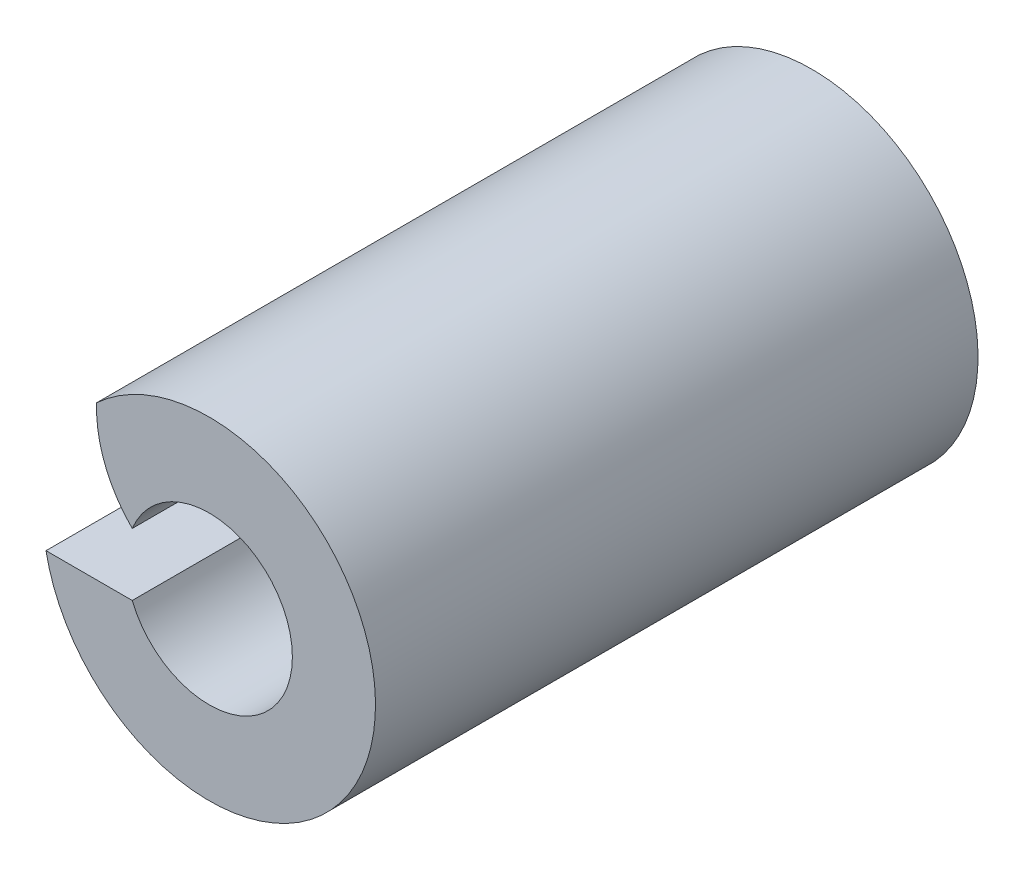
ISO-10303-21;
HEADER;
FILE_DESCRIPTION(('STEP AP214'),'2;1');
FILE_NAME('part.step','',(''),(''),'','','');
FILE_SCHEMA(('AUTOMOTIVE_DESIGN { 1 0 10303 214 1 1 1 1 }'));
ENDSEC;
DATA;
#1=APPLICATION_CONTEXT('core data for automotive mechanical design processes');
#2=APPLICATION_PROTOCOL_DEFINITION('international standard','automotive_design',2000,#1);
#3=PRODUCT_CONTEXT('',#1,'mechanical');
#4=PRODUCT('Part','Part','',(#3));
#5=PRODUCT_RELATED_PRODUCT_CATEGORY('part','',(#4));
#6=PRODUCT_DEFINITION_FORMATION('','',#4);
#7=PRODUCT_DEFINITION_CONTEXT('part definition',#1,'design');
#8=PRODUCT_DEFINITION('design','',#6,#7);
#9=PRODUCT_DEFINITION_SHAPE('','',#8);
#10=(LENGTH_UNIT() NAMED_UNIT(*) SI_UNIT(.MILLI.,.METRE.));
#11=(NAMED_UNIT(*) PLANE_ANGLE_UNIT() SI_UNIT($,.RADIAN.));
#12=(NAMED_UNIT(*) SI_UNIT($,.STERADIAN.) SOLID_ANGLE_UNIT());
#13=UNCERTAINTY_MEASURE_WITH_UNIT(LENGTH_MEASURE(1.E-05),#10,'distance_accuracy_value','');
#14=(GEOMETRIC_REPRESENTATION_CONTEXT(3) GLOBAL_UNCERTAINTY_ASSIGNED_CONTEXT((#13)) GLOBAL_UNIT_ASSIGNED_CONTEXT((#10,
#11,#12)) REPRESENTATION_CONTEXT('',''));
#15=CARTESIAN_POINT('',(0.,0.,0.));
#16=DIRECTION('',(0.,0.,1.));
#17=DIRECTION('',(1.,0.,0.));
#18=AXIS2_PLACEMENT_3D('',#15,#16,#17);
#19=CARTESIAN_POINT('',(3.52540589644163,-20.9362210225826,-255.725414047621));
#20=DIRECTION('',(0.,0.,-1.));
#21=DIRECTION('',(-1.,0.,0.));
#22=AXIS2_PLACEMENT_3D('',#19,#20,#21);
#23=CYLINDRICAL_SURFACE('',#22,4.00000000000018);
#24=CARTESIAN_POINT('',(3.52540589644163,-20.9362210225826,-278.252727894987));
#25=DIRECTION('',(0.,0.,1.));
#26=DIRECTION('',(1.,0.,0.));
#27=AXIS2_PLACEMENT_3D('',#24,#25,#26);
#28=CIRCLE('',#27,4.00000000000018);
#29=CARTESIAN_POINT('',(-0.182693347106395,-19.4362210225826,-278.252727894987));
#30=VERTEX_POINT('',#29);
#31=CARTESIAN_POINT('',(-0.182693347106395,-22.4362210225826,-278.252727894987));
#32=VERTEX_POINT('',#31);
#33=EDGE_CURVE('E98',#30,#32,#28,.F.);
#34=ORIENTED_EDGE('',*,*,#33,.F.);
#35=DIRECTION('',(0.,0.,-1.));
#36=VECTOR('',#35,1.);
#37=CARTESIAN_POINT('',(-0.182693347106395,-19.4362210225826,-255.725414047621));
#38=LINE('',#37,#36);
#39=CARTESIAN_POINT('',(-0.18269334710649,-19.4362210225826,-307.252727894987));
#40=VERTEX_POINT('',#39);
#41=EDGE_CURVE('E43',#30,#40,#38,.T.);
#42=ORIENTED_EDGE('',*,*,#41,.T.);
#43=CARTESIAN_POINT('',(3.52540589644163,-20.9362210225826,-307.252727894987));
#44=DIRECTION('',(0.,0.,-1.));
#45=DIRECTION('',(1.,0.,0.));
#46=AXIS2_PLACEMENT_3D('',#43,#44,#45);
#47=CIRCLE('',#46,4.00000000000018);
#48=CARTESIAN_POINT('',(-0.182693347106395,-22.4362210225826,-307.252727894987));
#49=VERTEX_POINT('',#48);
#50=EDGE_CURVE('E104',#40,#49,#47,.T.);
#51=ORIENTED_EDGE('',*,*,#50,.T.);
#52=DIRECTION('',(0.,0.,-1.));
#53=VECTOR('',#52,1.);
#54=CARTESIAN_POINT('',(-0.182693347106395,-22.4362210225826,-255.725414047621));
#55=LINE('',#54,#53);
#56=EDGE_CURVE('E74',#32,#49,#55,.T.);
#57=ORIENTED_EDGE('',*,*,#56,.F.);
#58=EDGE_LOOP('',(#34,#42,#51,#57));
#59=FACE_BOUND('',#58,.T.);
#60=ADVANCED_FACE('F39',(#59),#23,.F.);
#61=CARTESIAN_POINT('',(-4.33271092641837,-22.4362210225826,-255.725414047621));
#62=DIRECTION('',(0.,-1.,0.));
#63=DIRECTION('',(1.,0.,0.));
#64=AXIS2_PLACEMENT_3D('',#61,#62,#63);
#65=PLANE('',#64);
#66=DIRECTION('',(-1.,0.,0.));
#67=VECTOR('',#66,1.);
#68=CARTESIAN_POINT('',(-4.33271092641837,-22.4362210225826,-278.252727894987));
#69=LINE('',#68,#67);
#70=CARTESIAN_POINT('',(-4.33271092641837,-22.4362210225826,-278.252727894987));
#71=VERTEX_POINT('',#70);
#72=EDGE_CURVE('E48',#32,#71,#69,.T.);
#73=ORIENTED_EDGE('',*,*,#72,.F.);
#74=ORIENTED_EDGE('',*,*,#56,.T.);
#75=DIRECTION('',(-1.,0.,0.));
#76=VECTOR('',#75,1.);
#77=CARTESIAN_POINT('',(-4.33271092641837,-22.4362210225826,-307.252727894987));
#78=LINE('',#77,#76);
#79=CARTESIAN_POINT('',(-4.33271092641837,-22.4362210225826,-307.252727894987));
#80=VERTEX_POINT('',#79);
#81=EDGE_CURVE('E103',#49,#80,#78,.T.);
#82=ORIENTED_EDGE('',*,*,#81,.T.);
#83=DIRECTION('',(0.,0.,-1.));
#84=VECTOR('',#83,1.);
#85=CARTESIAN_POINT('',(-4.33271092641837,-22.4362210225826,-255.725414047621));
#86=LINE('',#85,#84);
#87=EDGE_CURVE('E64',#71,#80,#86,.T.);
#88=ORIENTED_EDGE('',*,*,#87,.F.);
#89=EDGE_LOOP('',(#73,#74,#82,#88));
#90=FACE_BOUND('',#89,.T.);
#91=ADVANCED_FACE('F119',(#90),#65,.F.);
#92=CARTESIAN_POINT('',(3.52540589644163,-20.9362210225826,-255.725414047621));
#93=DIRECTION('',(0.,0.,-1.));
#94=DIRECTION('',(-1.,0.,0.));
#95=AXIS2_PLACEMENT_3D('',#92,#93,#94);
#96=CYLINDRICAL_SURFACE('',#95,8.00000000010721);
#97=CARTESIAN_POINT('',(3.52540589644163,-20.9362210225826,-307.252727894987));
#98=DIRECTION('',(0.,0.,1.));
#99=DIRECTION('',(1.,0.,0.));
#100=AXIS2_PLACEMENT_3D('',#97,#98,#99);
#101=CIRCLE('',#100,8.00000000010721);
#102=CARTESIAN_POINT('',(-1.89412376723314,-15.051605637847,-307.252727894987));
#103=VERTEX_POINT('',#102);
#104=EDGE_CURVE('E95',#80,#103,#101,.T.);
#105=ORIENTED_EDGE('',*,*,#104,.T.);
#106=DIRECTION('',(0.,0.,1.));
#107=VECTOR('',#106,1.);
#108=CARTESIAN_POINT('',(-1.89412376723314,-15.051605637847,-313.289904220113));
#109=LINE('',#108,#107);
#110=CARTESIAN_POINT('',(-1.89412376723314,-15.051605637847,-278.252727894987));
#111=VERTEX_POINT('',#110);
#112=EDGE_CURVE('E87',#103,#111,#109,.T.);
#113=ORIENTED_EDGE('',*,*,#112,.T.);
#114=CARTESIAN_POINT('',(3.52540589644163,-20.9362210225826,-278.252727894987));
#115=DIRECTION('',(0.,0.,1.));
#116=DIRECTION('',(1.,0.,0.));
#117=AXIS2_PLACEMENT_3D('',#114,#115,#116);
#118=CIRCLE('',#117,8.00000000010721);
#119=EDGE_CURVE('E11',#71,#111,#118,.T.);
#120=ORIENTED_EDGE('',*,*,#119,.F.);
#121=ORIENTED_EDGE('',*,*,#87,.T.);
#122=EDGE_LOOP('',(#105,#113,#120,#121));
#123=FACE_BOUND('',#122,.T.);
#124=ADVANCED_FACE('F93',(#123),#96,.T.);
#125=CARTESIAN_POINT('',(3.52540589644163,-20.9362210225826,-307.252727894987));
#126=DIRECTION('',(0.,0.,1.));
#127=DIRECTION('',(1.,0.,0.));
#128=AXIS2_PLACEMENT_3D('',#125,#126,#127);
#129=PLANE('',#128);
#130=ORIENTED_EDGE('',*,*,#50,.F.);
#131=CARTESIAN_POINT('',(3.96102406270541,-15.2925036127707,-307.252727894987));
#132=DIRECTION('',(0.,0.,1.));
#133=DIRECTION('',(1.,0.,0.));
#134=AXIS2_PLACEMENT_3D('',#131,#132,#133);
#135=CIRCLE('',#134,5.8601013595975);
#136=EDGE_CURVE('E96',#103,#40,#135,.T.);
#137=ORIENTED_EDGE('',*,*,#136,.F.);
#138=ORIENTED_EDGE('',*,*,#104,.F.);
#139=ORIENTED_EDGE('',*,*,#81,.F.);
#140=EDGE_LOOP('',(#130,#137,#138,#139));
#141=FACE_BOUND('',#140,.T.);
#142=ADVANCED_FACE('F112',(#141),#129,.F.);
#143=CARTESIAN_POINT('',(3.52540589644178,-20.9362210225826,-278.252727894987));
#144=DIRECTION('',(0.,0.,1.));
#145=DIRECTION('',(-1.,0.,0.));
#146=AXIS2_PLACEMENT_3D('',#143,#144,#145);
#147=PLANE('',#146);
#148=CARTESIAN_POINT('',(3.96102406270541,-15.2925036127707,-278.252727894987));
#149=DIRECTION('',(0.,0.,-1.));
#150=DIRECTION('',(-1.,0.,0.));
#151=AXIS2_PLACEMENT_3D('',#148,#149,#150);
#152=CIRCLE('',#151,5.8601013595975);
#153=EDGE_CURVE('E84',#30,#111,#152,.T.);
#154=ORIENTED_EDGE('',*,*,#153,.F.);
#155=ORIENTED_EDGE('',*,*,#33,.T.);
#156=ORIENTED_EDGE('',*,*,#72,.T.);
#157=ORIENTED_EDGE('',*,*,#119,.T.);
#158=EDGE_LOOP('',(#154,#155,#156,#157));
#159=FACE_BOUND('',#158,.T.);
#160=ADVANCED_FACE('F41',(#159),#147,.T.);
#161=CARTESIAN_POINT('',(3.96102406270541,-15.2925036127707,-313.289904220113));
#162=DIRECTION('',(0.,0.,1.));
#163=DIRECTION('',(1.,0.,0.));
#164=AXIS2_PLACEMENT_3D('',#161,#162,#163);
#165=CYLINDRICAL_SURFACE('',#164,5.8601013595975);
#166=ORIENTED_EDGE('',*,*,#136,.T.);
#167=ORIENTED_EDGE('',*,*,#41,.F.);
#168=ORIENTED_EDGE('',*,*,#153,.T.);
#169=ORIENTED_EDGE('',*,*,#112,.F.);
#170=EDGE_LOOP('',(#166,#167,#168,#169));
#171=FACE_BOUND('',#170,.T.);
#172=ADVANCED_FACE('F86',(#171),#165,.T.);
#173=CLOSED_SHELL('',(#60,#91,#124,#142,#160,#172));
#174=MANIFOLD_SOLID_BREP('B2',#173);
#175=ADVANCED_BREP_SHAPE_REPRESENTATION('',(#18,#174),#14);
#176=SHAPE_DEFINITION_REPRESENTATION(#9,#175);
ENDSEC;
END-ISO-10303-21;
